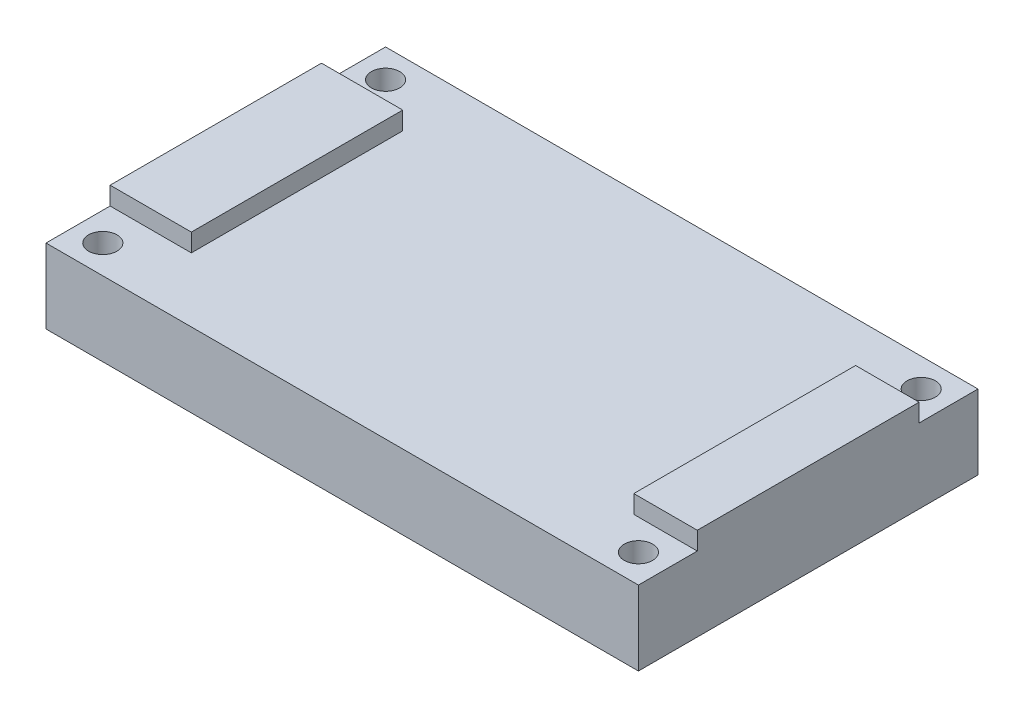
ISO-10303-21;
HEADER;
FILE_DESCRIPTION(('STEP AP214'),'2;1');
FILE_NAME('part.step','',(''),(''),'','','');
FILE_SCHEMA(('AUTOMOTIVE_DESIGN { 1 0 10303 214 1 1 1 1 }'));
ENDSEC;
DATA;
#1=APPLICATION_CONTEXT('core data for automotive mechanical design processes');
#2=APPLICATION_PROTOCOL_DEFINITION('international standard','automotive_design',2000,#1);
#3=PRODUCT_CONTEXT('',#1,'mechanical');
#4=PRODUCT('Part','Part','',(#3));
#5=PRODUCT_RELATED_PRODUCT_CATEGORY('part','',(#4));
#6=PRODUCT_DEFINITION_FORMATION('','',#4);
#7=PRODUCT_DEFINITION_CONTEXT('part definition',#1,'design');
#8=PRODUCT_DEFINITION('design','',#6,#7);
#9=PRODUCT_DEFINITION_SHAPE('','',#8);
#10=(LENGTH_UNIT() NAMED_UNIT(*) SI_UNIT(.MILLI.,.METRE.));
#11=(NAMED_UNIT(*) PLANE_ANGLE_UNIT() SI_UNIT($,.RADIAN.));
#12=(NAMED_UNIT(*) SI_UNIT($,.STERADIAN.) SOLID_ANGLE_UNIT());
#13=UNCERTAINTY_MEASURE_WITH_UNIT(LENGTH_MEASURE(1.E-05),#10,'distance_accuracy_value','');
#14=(GEOMETRIC_REPRESENTATION_CONTEXT(3) GLOBAL_UNCERTAINTY_ASSIGNED_CONTEXT((#13)) GLOBAL_UNIT_ASSIGNED_CONTEXT((#10,
#11,#12)) REPRESENTATION_CONTEXT('',''));
#15=CARTESIAN_POINT('',(0.,0.,0.));
#16=DIRECTION('',(0.,0.,1.));
#17=DIRECTION('',(1.,0.,0.));
#18=AXIS2_PLACEMENT_3D('',#15,#16,#17);
#19=CARTESIAN_POINT('',(0.,5.2451,0.));
#20=DIRECTION('',(0.,1.,0.));
#21=DIRECTION('',(0.,0.,1.));
#22=AXIS2_PLACEMENT_3D('',#19,#20,#21);
#23=PLANE('',#22);
#24=CARTESIAN_POINT('',(-18.85975,5.2451,9.95705));
#25=DIRECTION('',(0.,1.,0.));
#26=DIRECTION('',(0.,0.,1.));
#27=AXIS2_PLACEMENT_3D('',#24,#25,#26);
#28=CIRCLE('',#27,1.);
#29=CARTESIAN_POINT('',(-18.85975,5.2451,10.95705));
#30=VERTEX_POINT('',#29);
#31=EDGE_CURVE('E199',#30,#30,#28,.T.);
#32=ORIENTED_EDGE('',*,*,#31,.F.);
#33=EDGE_LOOP('',(#32));
#34=FACE_BOUND('',#33,.T.);
#35=CARTESIAN_POINT('',(18.85975,5.2451,9.95705));
#36=DIRECTION('',(0.,1.,0.));
#37=DIRECTION('',(0.,0.,1.));
#38=AXIS2_PLACEMENT_3D('',#35,#36,#37);
#39=CIRCLE('',#38,1.);
#40=CARTESIAN_POINT('',(18.85975,5.2451,10.95705));
#41=VERTEX_POINT('',#40);
#42=EDGE_CURVE('E196',#41,#41,#39,.T.);
#43=ORIENTED_EDGE('',*,*,#42,.F.);
#44=EDGE_LOOP('',(#43));
#45=FACE_BOUND('',#44,.T.);
#46=CARTESIAN_POINT('',(18.85975,5.2451,-9.95705));
#47=DIRECTION('',(0.,1.,0.));
#48=DIRECTION('',(0.,0.,1.));
#49=AXIS2_PLACEMENT_3D('',#46,#47,#48);
#50=CIRCLE('',#49,1.);
#51=CARTESIAN_POINT('',(18.85975,5.2451,-8.95705));
#52=VERTEX_POINT('',#51);
#53=EDGE_CURVE('E193',#52,#52,#50,.T.);
#54=ORIENTED_EDGE('',*,*,#53,.F.);
#55=EDGE_LOOP('',(#54));
#56=FACE_BOUND('',#55,.T.);
#57=CARTESIAN_POINT('',(-18.85975,5.2451,-9.95705));
#58=DIRECTION('',(0.,1.,0.));
#59=DIRECTION('',(0.,0.,1.));
#60=AXIS2_PLACEMENT_3D('',#57,#58,#59);
#61=CIRCLE('',#60,1.);
#62=CARTESIAN_POINT('',(-18.85975,5.2451,-8.95705));
#63=VERTEX_POINT('',#62);
#64=EDGE_CURVE('E190',#63,#63,#61,.T.);
#65=ORIENTED_EDGE('',*,*,#64,.F.);
#66=EDGE_LOOP('',(#65));
#67=FACE_BOUND('',#66,.T.);
#68=DIRECTION('',(0.,0.,-1.));
#69=VECTOR('',#68,1.);
#70=CARTESIAN_POINT('',(-15.1390278048941,5.2451,-7.4422));
#71=LINE('',#70,#69);
#72=CARTESIAN_POINT('',(-15.1390278048941,5.2451,7.4422));
#73=VERTEX_POINT('',#72);
#74=CARTESIAN_POINT('',(-15.1390278048941,5.2451,-7.4422));
#75=VERTEX_POINT('',#74);
#76=EDGE_CURVE('E294',#73,#75,#71,.T.);
#77=ORIENTED_EDGE('',*,*,#76,.F.);
#78=DIRECTION('',(1.,0.,0.));
#79=VECTOR('',#78,1.);
#80=CARTESIAN_POINT('',(-20.85975,5.2451,7.4422));
#81=LINE('',#80,#79);
#82=CARTESIAN_POINT('',(-20.85975,5.2451,7.4422));
#83=VERTEX_POINT('',#82);
#84=EDGE_CURVE('E293',#83,#73,#81,.T.);
#85=ORIENTED_EDGE('',*,*,#84,.F.);
#86=DIRECTION('',(0.,0.,1.));
#87=VECTOR('',#86,1.);
#88=CARTESIAN_POINT('',(-20.85975,5.2451,11.95705));
#89=LINE('',#88,#87);
#90=CARTESIAN_POINT('',(-20.85975,5.2451,11.95705));
#91=VERTEX_POINT('',#90);
#92=EDGE_CURVE('E146',#83,#91,#89,.T.);
#93=ORIENTED_EDGE('',*,*,#92,.T.);
#94=DIRECTION('',(1.,0.,0.));
#95=VECTOR('',#94,1.);
#96=CARTESIAN_POINT('',(20.85975,5.2451,11.95705));
#97=LINE('',#96,#95);
#98=CARTESIAN_POINT('',(20.85975,5.2451,11.95705));
#99=VERTEX_POINT('',#98);
#100=EDGE_CURVE('E206',#91,#99,#97,.T.);
#101=ORIENTED_EDGE('',*,*,#100,.T.);
#102=DIRECTION('',(0.,0.,-1.));
#103=VECTOR('',#102,1.);
#104=CARTESIAN_POINT('',(20.85975,5.2451,11.95705));
#105=LINE('',#104,#103);
#106=CARTESIAN_POINT('',(20.85975,5.2451,7.8105));
#107=VERTEX_POINT('',#106);
#108=EDGE_CURVE('E209',#99,#107,#105,.T.);
#109=ORIENTED_EDGE('',*,*,#108,.T.);
#110=DIRECTION('',(1.,0.,0.));
#111=VECTOR('',#110,1.);
#112=CARTESIAN_POINT('',(20.85975,5.2451,7.8105));
#113=LINE('',#112,#111);
#114=CARTESIAN_POINT('',(16.3871308605648,5.2451,7.8105));
#115=VERTEX_POINT('',#114);
#116=EDGE_CURVE('E56',#115,#107,#113,.T.);
#117=ORIENTED_EDGE('',*,*,#116,.F.);
#118=DIRECTION('',(0.,0.,1.));
#119=VECTOR('',#118,1.);
#120=CARTESIAN_POINT('',(16.3871308605648,5.2451,-7.8105));
#121=LINE('',#120,#119);
#122=CARTESIAN_POINT('',(16.3871308605648,5.2451,-7.8105));
#123=VERTEX_POINT('',#122);
#124=EDGE_CURVE('E150',#123,#115,#121,.T.);
#125=ORIENTED_EDGE('',*,*,#124,.F.);
#126=DIRECTION('',(-1.,0.,0.));
#127=VECTOR('',#126,1.);
#128=CARTESIAN_POINT('',(20.85975,5.2451,-7.8105));
#129=LINE('',#128,#127);
#130=CARTESIAN_POINT('',(20.85975,5.2451,-7.81049999999999));
#131=VERTEX_POINT('',#130);
#132=EDGE_CURVE('E147',#131,#123,#129,.T.);
#133=ORIENTED_EDGE('',*,*,#132,.F.);
#134=CARTESIAN_POINT('',(20.85975,5.2451,-11.95705));
#135=VERTEX_POINT('',#134);
#136=EDGE_CURVE('E208',#131,#135,#105,.T.);
#137=ORIENTED_EDGE('',*,*,#136,.T.);
#138=DIRECTION('',(-1.,0.,0.));
#139=VECTOR('',#138,1.);
#140=CARTESIAN_POINT('',(20.85975,5.2451,-11.95705));
#141=LINE('',#140,#139);
#142=CARTESIAN_POINT('',(-20.85975,5.2451,-11.95705));
#143=VERTEX_POINT('',#142);
#144=EDGE_CURVE('E211',#135,#143,#141,.T.);
#145=ORIENTED_EDGE('',*,*,#144,.T.);
#146=CARTESIAN_POINT('',(-20.85975,5.2451,-7.4422));
#147=VERTEX_POINT('',#146);
#148=EDGE_CURVE('E203',#143,#147,#89,.T.);
#149=ORIENTED_EDGE('',*,*,#148,.T.);
#150=DIRECTION('',(-1.,0.,0.));
#151=VECTOR('',#150,1.);
#152=CARTESIAN_POINT('',(-20.85975,5.2451,-7.4422));
#153=LINE('',#152,#151);
#154=EDGE_CURVE('E141',#75,#147,#153,.T.);
#155=ORIENTED_EDGE('',*,*,#154,.F.);
#156=EDGE_LOOP('',(#77,#85,#93,#101,#109,#117,#125,#133,#137,#145,#149,#155));
#157=FACE_BOUND('',#156,.T.);
#158=ADVANCED_FACE('F33',(#34,#45,#56,#67,#157),#23,.T.);
#159=CARTESIAN_POINT('',(-20.85975,5.2451,11.95705));
#160=DIRECTION('',(1.,0.,0.));
#161=DIRECTION('',(0.,0.,-1.));
#162=AXIS2_PLACEMENT_3D('',#159,#160,#161);
#163=PLANE('',#162);
#164=DIRECTION('',(0.,0.,1.));
#165=VECTOR('',#164,1.);
#166=CARTESIAN_POINT('',(-20.85975,0.,11.95705));
#167=LINE('',#166,#165);
#168=CARTESIAN_POINT('',(-20.85975,0.,-11.95705));
#169=VERTEX_POINT('',#168);
#170=CARTESIAN_POINT('',(-20.85975,0.,11.95705));
#171=VERTEX_POINT('',#170);
#172=EDGE_CURVE('E202',#169,#171,#167,.T.);
#173=ORIENTED_EDGE('',*,*,#172,.T.);
#174=DIRECTION('',(0.,-1.,0.));
#175=VECTOR('',#174,1.);
#176=CARTESIAN_POINT('',(-20.85975,5.2451,11.95705));
#177=LINE('',#176,#175);
#178=EDGE_CURVE('E11',#91,#171,#177,.T.);
#179=ORIENTED_EDGE('',*,*,#178,.F.);
#180=ORIENTED_EDGE('',*,*,#92,.F.);
#181=DIRECTION('',(0.,-1.,0.));
#182=VECTOR('',#181,1.);
#183=CARTESIAN_POINT('',(-20.85975,6.5151,7.4422));
#184=LINE('',#183,#182);
#185=CARTESIAN_POINT('',(-20.85975,6.5151,7.4422));
#186=VERTEX_POINT('',#185);
#187=EDGE_CURVE('E126',#186,#83,#184,.T.);
#188=ORIENTED_EDGE('',*,*,#187,.F.);
#189=DIRECTION('',(0.,0.,1.));
#190=VECTOR('',#189,1.);
#191=CARTESIAN_POINT('',(-20.85975,6.5151,-7.4422));
#192=LINE('',#191,#190);
#193=CARTESIAN_POINT('',(-20.85975,6.5151,-7.4422));
#194=VERTEX_POINT('',#193);
#195=EDGE_CURVE('E133',#194,#186,#192,.T.);
#196=ORIENTED_EDGE('',*,*,#195,.F.);
#197=DIRECTION('',(0.,-1.,0.));
#198=VECTOR('',#197,1.);
#199=CARTESIAN_POINT('',(-20.85975,6.5151,-7.4422));
#200=LINE('',#199,#198);
#201=EDGE_CURVE('E243',#194,#147,#200,.T.);
#202=ORIENTED_EDGE('',*,*,#201,.T.);
#203=ORIENTED_EDGE('',*,*,#148,.F.);
#204=DIRECTION('',(0.,-1.,0.));
#205=VECTOR('',#204,1.);
#206=CARTESIAN_POINT('',(-20.85975,5.2451,-11.95705));
#207=LINE('',#206,#205);
#208=EDGE_CURVE('E213',#143,#169,#207,.T.);
#209=ORIENTED_EDGE('',*,*,#208,.T.);
#210=EDGE_LOOP('',(#173,#179,#180,#188,#196,#202,#203,#209));
#211=FACE_BOUND('',#210,.T.);
#212=ADVANCED_FACE('F35',(#211),#163,.F.);
#213=CARTESIAN_POINT('',(20.85975,5.2451,11.95705));
#214=DIRECTION('',(0.,0.,-1.));
#215=DIRECTION('',(-1.,0.,0.));
#216=AXIS2_PLACEMENT_3D('',#213,#214,#215);
#217=PLANE('',#216);
#218=DIRECTION('',(1.,0.,0.));
#219=VECTOR('',#218,1.);
#220=CARTESIAN_POINT('',(20.85975,0.,11.95705));
#221=LINE('',#220,#219);
#222=CARTESIAN_POINT('',(20.85975,0.,11.95705));
#223=VERTEX_POINT('',#222);
#224=EDGE_CURVE('E215',#171,#223,#221,.T.);
#225=ORIENTED_EDGE('',*,*,#224,.T.);
#226=DIRECTION('',(0.,-1.,0.));
#227=VECTOR('',#226,1.);
#228=CARTESIAN_POINT('',(20.85975,5.2451,11.95705));
#229=LINE('',#228,#227);
#230=EDGE_CURVE('E41',#99,#223,#229,.T.);
#231=ORIENTED_EDGE('',*,*,#230,.F.);
#232=ORIENTED_EDGE('',*,*,#100,.F.);
#233=ORIENTED_EDGE('',*,*,#178,.T.);
#234=EDGE_LOOP('',(#225,#231,#232,#233));
#235=FACE_BOUND('',#234,.T.);
#236=ADVANCED_FACE('F277',(#235),#217,.F.);
#237=CARTESIAN_POINT('',(20.85975,5.2451,11.95705));
#238=DIRECTION('',(-1.,0.,0.));
#239=DIRECTION('',(0.,0.,1.));
#240=AXIS2_PLACEMENT_3D('',#237,#238,#239);
#241=PLANE('',#240);
#242=DIRECTION('',(0.,0.,-1.));
#243=VECTOR('',#242,1.);
#244=CARTESIAN_POINT('',(20.85975,0.,11.95705));
#245=LINE('',#244,#243);
#246=CARTESIAN_POINT('',(20.85975,0.,-11.95705));
#247=VERTEX_POINT('',#246);
#248=EDGE_CURVE('E217',#223,#247,#245,.T.);
#249=ORIENTED_EDGE('',*,*,#248,.T.);
#250=DIRECTION('',(0.,-1.,0.));
#251=VECTOR('',#250,1.);
#252=CARTESIAN_POINT('',(20.85975,5.2451,-11.95705));
#253=LINE('',#252,#251);
#254=EDGE_CURVE('E223',#135,#247,#253,.T.);
#255=ORIENTED_EDGE('',*,*,#254,.F.);
#256=ORIENTED_EDGE('',*,*,#136,.F.);
#257=DIRECTION('',(0.,-1.,0.));
#258=VECTOR('',#257,1.);
#259=CARTESIAN_POINT('',(20.85975,6.5151,-7.8105));
#260=LINE('',#259,#258);
#261=CARTESIAN_POINT('',(20.85975,6.5151,-7.8105));
#262=VERTEX_POINT('',#261);
#263=EDGE_CURVE('E175',#262,#131,#260,.T.);
#264=ORIENTED_EDGE('',*,*,#263,.F.);
#265=DIRECTION('',(0.,0.,-1.));
#266=VECTOR('',#265,1.);
#267=CARTESIAN_POINT('',(20.85975,6.5151,-7.8105));
#268=LINE('',#267,#266);
#269=CARTESIAN_POINT('',(20.85975,6.5151,7.8105));
#270=VERTEX_POINT('',#269);
#271=EDGE_CURVE('E155',#270,#262,#268,.T.);
#272=ORIENTED_EDGE('',*,*,#271,.F.);
#273=DIRECTION('',(0.,-1.,0.));
#274=VECTOR('',#273,1.);
#275=CARTESIAN_POINT('',(20.85975,6.5151,7.8105));
#276=LINE('',#275,#274);
#277=EDGE_CURVE('E163',#270,#107,#276,.T.);
#278=ORIENTED_EDGE('',*,*,#277,.T.);
#279=ORIENTED_EDGE('',*,*,#108,.F.);
#280=ORIENTED_EDGE('',*,*,#230,.T.);
#281=EDGE_LOOP('',(#249,#255,#256,#264,#272,#278,#279,#280));
#282=FACE_BOUND('',#281,.T.);
#283=ADVANCED_FACE('F230',(#282),#241,.F.);
#284=CARTESIAN_POINT('',(20.85975,5.2451,-11.95705));
#285=DIRECTION('',(0.,0.,1.));
#286=DIRECTION('',(1.,0.,0.));
#287=AXIS2_PLACEMENT_3D('',#284,#285,#286);
#288=PLANE('',#287);
#289=DIRECTION('',(-1.,0.,0.));
#290=VECTOR('',#289,1.);
#291=CARTESIAN_POINT('',(20.85975,0.,-11.95705));
#292=LINE('',#291,#290);
#293=EDGE_CURVE('E219',#247,#169,#292,.T.);
#294=ORIENTED_EDGE('',*,*,#293,.T.);
#295=ORIENTED_EDGE('',*,*,#208,.F.);
#296=ORIENTED_EDGE('',*,*,#144,.F.);
#297=ORIENTED_EDGE('',*,*,#254,.T.);
#298=EDGE_LOOP('',(#294,#295,#296,#297));
#299=FACE_BOUND('',#298,.T.);
#300=ADVANCED_FACE('F240',(#299),#288,.F.);
#301=CARTESIAN_POINT('',(0.,0.,0.));
#302=DIRECTION('',(0.,1.,0.));
#303=DIRECTION('',(0.,0.,1.));
#304=AXIS2_PLACEMENT_3D('',#301,#302,#303);
#305=PLANE('',#304);
#306=CARTESIAN_POINT('',(-18.85975,0.,9.95705));
#307=DIRECTION('',(0.,1.,0.));
#308=DIRECTION('',(0.,0.,-1.));
#309=AXIS2_PLACEMENT_3D('',#306,#307,#308);
#310=CIRCLE('',#309,1.);
#311=CARTESIAN_POINT('',(-18.85975,0.,8.95705));
#312=VERTEX_POINT('',#311);
#313=EDGE_CURVE('E178',#312,#312,#310,.T.);
#314=ORIENTED_EDGE('',*,*,#313,.T.);
#315=EDGE_LOOP('',(#314));
#316=FACE_BOUND('',#315,.T.);
#317=CARTESIAN_POINT('',(18.85975,0.,9.95705));
#318=DIRECTION('',(0.,1.,0.));
#319=DIRECTION('',(0.,0.,1.));
#320=AXIS2_PLACEMENT_3D('',#317,#318,#319);
#321=CIRCLE('',#320,1.);
#322=CARTESIAN_POINT('',(18.85975,0.,10.95705));
#323=VERTEX_POINT('',#322);
#324=EDGE_CURVE('E183',#323,#323,#321,.T.);
#325=ORIENTED_EDGE('',*,*,#324,.T.);
#326=EDGE_LOOP('',(#325));
#327=FACE_BOUND('',#326,.T.);
#328=CARTESIAN_POINT('',(18.85975,0.,-9.95705));
#329=DIRECTION('',(0.,1.,0.));
#330=DIRECTION('',(0.,0.,-1.));
#331=AXIS2_PLACEMENT_3D('',#328,#329,#330);
#332=CIRCLE('',#331,1.);
#333=CARTESIAN_POINT('',(18.85975,0.,-10.95705));
#334=VERTEX_POINT('',#333);
#335=EDGE_CURVE('E179',#334,#334,#332,.T.);
#336=ORIENTED_EDGE('',*,*,#335,.T.);
#337=EDGE_LOOP('',(#336));
#338=FACE_BOUND('',#337,.T.);
#339=CARTESIAN_POINT('',(-18.85975,0.,-9.95705));
#340=DIRECTION('',(0.,1.,0.));
#341=DIRECTION('',(0.,0.,1.));
#342=AXIS2_PLACEMENT_3D('',#339,#340,#341);
#343=CIRCLE('',#342,1.);
#344=CARTESIAN_POINT('',(-18.85975,0.,-8.95705));
#345=VERTEX_POINT('',#344);
#346=EDGE_CURVE('E182',#345,#345,#343,.T.);
#347=ORIENTED_EDGE('',*,*,#346,.T.);
#348=EDGE_LOOP('',(#347));
#349=FACE_BOUND('',#348,.T.);
#350=ORIENTED_EDGE('',*,*,#172,.F.);
#351=ORIENTED_EDGE('',*,*,#293,.F.);
#352=ORIENTED_EDGE('',*,*,#248,.F.);
#353=ORIENTED_EDGE('',*,*,#224,.F.);
#354=EDGE_LOOP('',(#350,#351,#352,#353));
#355=FACE_BOUND('',#354,.T.);
#356=ADVANCED_FACE('F237',(#316,#327,#338,#349,#355),#305,.F.);
#357=CARTESIAN_POINT('',(-18.85975,0.,-9.95705));
#358=DIRECTION('',(0.,1.,0.));
#359=DIRECTION('',(0.,0.,1.));
#360=AXIS2_PLACEMENT_3D('',#357,#358,#359);
#361=CYLINDRICAL_SURFACE('',#360,1.);
#362=ORIENTED_EDGE('',*,*,#64,.T.);
#363=EDGE_LOOP('',(#362));
#364=FACE_BOUND('',#363,.T.);
#365=ORIENTED_EDGE('',*,*,#346,.F.);
#366=EDGE_LOOP('',(#365));
#367=FACE_BOUND('',#366,.T.);
#368=ADVANCED_FACE('F282',(#364,#367),#361,.F.);
#369=CARTESIAN_POINT('',(18.85975,0.,-9.95705));
#370=DIRECTION('',(0.,1.,0.));
#371=DIRECTION('',(0.,0.,1.));
#372=AXIS2_PLACEMENT_3D('',#369,#370,#371);
#373=CYLINDRICAL_SURFACE('',#372,1.);
#374=ORIENTED_EDGE('',*,*,#53,.T.);
#375=EDGE_LOOP('',(#374));
#376=FACE_BOUND('',#375,.T.);
#377=ORIENTED_EDGE('',*,*,#335,.F.);
#378=EDGE_LOOP('',(#377));
#379=FACE_BOUND('',#378,.T.);
#380=ADVANCED_FACE('F395',(#376,#379),#373,.F.);
#381=CARTESIAN_POINT('',(18.85975,0.,9.95705));
#382=DIRECTION('',(0.,1.,0.));
#383=DIRECTION('',(0.,0.,1.));
#384=AXIS2_PLACEMENT_3D('',#381,#382,#383);
#385=CYLINDRICAL_SURFACE('',#384,1.);
#386=ORIENTED_EDGE('',*,*,#42,.T.);
#387=EDGE_LOOP('',(#386));
#388=FACE_BOUND('',#387,.T.);
#389=ORIENTED_EDGE('',*,*,#324,.F.);
#390=EDGE_LOOP('',(#389));
#391=FACE_BOUND('',#390,.T.);
#392=ADVANCED_FACE('F387',(#388,#391),#385,.F.);
#393=CARTESIAN_POINT('',(-18.85975,0.,9.95705));
#394=DIRECTION('',(0.,1.,0.));
#395=DIRECTION('',(0.,0.,1.));
#396=AXIS2_PLACEMENT_3D('',#393,#394,#395);
#397=CYLINDRICAL_SURFACE('',#396,1.);
#398=ORIENTED_EDGE('',*,*,#31,.T.);
#399=EDGE_LOOP('',(#398));
#400=FACE_BOUND('',#399,.T.);
#401=ORIENTED_EDGE('',*,*,#313,.F.);
#402=EDGE_LOOP('',(#401));
#403=FACE_BOUND('',#402,.T.);
#404=ADVANCED_FACE('F269',(#400,#403),#397,.F.);
#405=CARTESIAN_POINT('',(20.85975,6.5151,-7.8105));
#406=DIRECTION('',(0.,0.,1.));
#407=DIRECTION('',(1.,0.,0.));
#408=AXIS2_PLACEMENT_3D('',#405,#406,#407);
#409=PLANE('',#408);
#410=ORIENTED_EDGE('',*,*,#132,.T.);
#411=DIRECTION('',(0.,-1.,0.));
#412=VECTOR('',#411,1.);
#413=CARTESIAN_POINT('',(16.3871308605648,6.5151,-7.8105));
#414=LINE('',#413,#412);
#415=CARTESIAN_POINT('',(16.3871308605648,6.5151,-7.8105));
#416=VERTEX_POINT('',#415);
#417=EDGE_CURVE('E172',#416,#123,#414,.T.);
#418=ORIENTED_EDGE('',*,*,#417,.F.);
#419=DIRECTION('',(-1.,0.,0.));
#420=VECTOR('',#419,1.);
#421=CARTESIAN_POINT('',(20.85975,6.5151,-7.8105));
#422=LINE('',#421,#420);
#423=EDGE_CURVE('E158',#262,#416,#422,.T.);
#424=ORIENTED_EDGE('',*,*,#423,.F.);
#425=ORIENTED_EDGE('',*,*,#263,.T.);
#426=EDGE_LOOP('',(#410,#418,#424,#425));
#427=FACE_BOUND('',#426,.T.);
#428=ADVANCED_FACE('F250',(#427),#409,.F.);
#429=CARTESIAN_POINT('',(16.3871308605648,6.5151,-7.8105));
#430=DIRECTION('',(1.,0.,0.));
#431=DIRECTION('',(0.,0.,-1.));
#432=AXIS2_PLACEMENT_3D('',#429,#430,#431);
#433=PLANE('',#432);
#434=ORIENTED_EDGE('',*,*,#124,.T.);
#435=DIRECTION('',(0.,-1.,0.));
#436=VECTOR('',#435,1.);
#437=CARTESIAN_POINT('',(16.3871308605648,6.5151,7.8105));
#438=LINE('',#437,#436);
#439=CARTESIAN_POINT('',(16.3871308605648,6.5151,7.8105));
#440=VERTEX_POINT('',#439);
#441=EDGE_CURVE('E169',#440,#115,#438,.T.);
#442=ORIENTED_EDGE('',*,*,#441,.F.);
#443=DIRECTION('',(0.,0.,1.));
#444=VECTOR('',#443,1.);
#445=CARTESIAN_POINT('',(16.3871308605648,6.5151,-7.8105));
#446=LINE('',#445,#444);
#447=EDGE_CURVE('E160',#416,#440,#446,.T.);
#448=ORIENTED_EDGE('',*,*,#447,.F.);
#449=ORIENTED_EDGE('',*,*,#417,.T.);
#450=EDGE_LOOP('',(#434,#442,#448,#449));
#451=FACE_BOUND('',#450,.T.);
#452=ADVANCED_FACE('F261',(#451),#433,.F.);
#453=CARTESIAN_POINT('',(20.85975,6.5151,7.8105));
#454=DIRECTION('',(0.,0.,-1.));
#455=DIRECTION('',(-1.,0.,0.));
#456=AXIS2_PLACEMENT_3D('',#453,#454,#455);
#457=PLANE('',#456);
#458=ORIENTED_EDGE('',*,*,#116,.T.);
#459=ORIENTED_EDGE('',*,*,#277,.F.);
#460=DIRECTION('',(1.,0.,0.));
#461=VECTOR('',#460,1.);
#462=CARTESIAN_POINT('',(20.85975,6.5151,7.8105));
#463=LINE('',#462,#461);
#464=EDGE_CURVE('E162',#440,#270,#463,.T.);
#465=ORIENTED_EDGE('',*,*,#464,.F.);
#466=ORIENTED_EDGE('',*,*,#441,.T.);
#467=EDGE_LOOP('',(#458,#459,#465,#466));
#468=FACE_BOUND('',#467,.T.);
#469=ADVANCED_FACE('F258',(#468),#457,.F.);
#470=CARTESIAN_POINT('',(0.,6.5151,0.));
#471=DIRECTION('',(0.,-1.,0.));
#472=DIRECTION('',(0.,0.,-1.));
#473=AXIS2_PLACEMENT_3D('',#470,#471,#472);
#474=PLANE('',#473);
#475=ORIENTED_EDGE('',*,*,#271,.T.);
#476=ORIENTED_EDGE('',*,*,#423,.T.);
#477=ORIENTED_EDGE('',*,*,#447,.T.);
#478=ORIENTED_EDGE('',*,*,#464,.T.);
#479=EDGE_LOOP('',(#475,#476,#477,#478));
#480=FACE_BOUND('',#479,.T.);
#481=ADVANCED_FACE('F254',(#480),#474,.F.);
#482=CARTESIAN_POINT('',(-20.85975,6.5151,7.4422));
#483=DIRECTION('',(0.,0.,-1.));
#484=DIRECTION('',(-1.,0.,0.));
#485=AXIS2_PLACEMENT_3D('',#482,#483,#484);
#486=PLANE('',#485);
#487=ORIENTED_EDGE('',*,*,#84,.T.);
#488=DIRECTION('',(0.,-1.,0.));
#489=VECTOR('',#488,1.);
#490=CARTESIAN_POINT('',(-15.1390278048941,6.5151,7.4422));
#491=LINE('',#490,#489);
#492=CARTESIAN_POINT('',(-15.1390278048941,6.5151,7.4422));
#493=VERTEX_POINT('',#492);
#494=EDGE_CURVE('E129',#493,#73,#491,.T.);
#495=ORIENTED_EDGE('',*,*,#494,.F.);
#496=DIRECTION('',(1.,0.,0.));
#497=VECTOR('',#496,1.);
#498=CARTESIAN_POINT('',(-20.85975,6.5151,7.4422));
#499=LINE('',#498,#497);
#500=EDGE_CURVE('E122',#186,#493,#499,.T.);
#501=ORIENTED_EDGE('',*,*,#500,.F.);
#502=ORIENTED_EDGE('',*,*,#187,.T.);
#503=EDGE_LOOP('',(#487,#495,#501,#502));
#504=FACE_BOUND('',#503,.T.);
#505=ADVANCED_FACE('F124',(#504),#486,.F.);
#506=CARTESIAN_POINT('',(-15.1390278048941,6.5151,-7.4422));
#507=DIRECTION('',(-1.,0.,0.));
#508=DIRECTION('',(0.,0.,1.));
#509=AXIS2_PLACEMENT_3D('',#506,#507,#508);
#510=PLANE('',#509);
#511=ORIENTED_EDGE('',*,*,#76,.T.);
#512=DIRECTION('',(0.,-1.,0.));
#513=VECTOR('',#512,1.);
#514=CARTESIAN_POINT('',(-15.1390278048941,6.5151,-7.4422));
#515=LINE('',#514,#513);
#516=CARTESIAN_POINT('',(-15.1390278048941,6.5151,-7.4422));
#517=VERTEX_POINT('',#516);
#518=EDGE_CURVE('E48',#517,#75,#515,.T.);
#519=ORIENTED_EDGE('',*,*,#518,.F.);
#520=DIRECTION('',(0.,0.,-1.));
#521=VECTOR('',#520,1.);
#522=CARTESIAN_POINT('',(-15.1390278048941,6.5151,-7.4422));
#523=LINE('',#522,#521);
#524=EDGE_CURVE('E132',#493,#517,#523,.T.);
#525=ORIENTED_EDGE('',*,*,#524,.F.);
#526=ORIENTED_EDGE('',*,*,#494,.T.);
#527=EDGE_LOOP('',(#511,#519,#525,#526));
#528=FACE_BOUND('',#527,.T.);
#529=ADVANCED_FACE('F302',(#528),#510,.F.);
#530=CARTESIAN_POINT('',(-20.85975,6.5151,-7.4422));
#531=DIRECTION('',(0.,0.,1.));
#532=DIRECTION('',(1.,0.,0.));
#533=AXIS2_PLACEMENT_3D('',#530,#531,#532);
#534=PLANE('',#533);
#535=ORIENTED_EDGE('',*,*,#154,.T.);
#536=ORIENTED_EDGE('',*,*,#201,.F.);
#537=DIRECTION('',(-1.,0.,0.));
#538=VECTOR('',#537,1.);
#539=CARTESIAN_POINT('',(-20.85975,6.5151,-7.4422));
#540=LINE('',#539,#538);
#541=EDGE_CURVE('E137',#517,#194,#540,.T.);
#542=ORIENTED_EDGE('',*,*,#541,.F.);
#543=ORIENTED_EDGE('',*,*,#518,.T.);
#544=EDGE_LOOP('',(#535,#536,#542,#543));
#545=FACE_BOUND('',#544,.T.);
#546=ADVANCED_FACE('F303',(#545),#534,.F.);
#547=CARTESIAN_POINT('',(0.,6.5151,0.));
#548=DIRECTION('',(0.,1.,0.));
#549=DIRECTION('',(0.,0.,1.));
#550=AXIS2_PLACEMENT_3D('',#547,#548,#549);
#551=PLANE('',#550);
#552=ORIENTED_EDGE('',*,*,#195,.T.);
#553=ORIENTED_EDGE('',*,*,#500,.T.);
#554=ORIENTED_EDGE('',*,*,#524,.T.);
#555=ORIENTED_EDGE('',*,*,#541,.T.);
#556=EDGE_LOOP('',(#552,#553,#554,#555));
#557=FACE_BOUND('',#556,.T.);
#558=ADVANCED_FACE('F136',(#557),#551,.T.);
#559=CLOSED_SHELL('',(#158,#212,#236,#283,#300,#356,#368,#380,#392,#404,#428,#452,#469,#481,
#505,#529,#546,#558));
#560=MANIFOLD_SOLID_BREP('B2',#559);
#561=ADVANCED_BREP_SHAPE_REPRESENTATION('',(#18,#560),#14);
#562=SHAPE_DEFINITION_REPRESENTATION(#9,#561);
ENDSEC;
END-ISO-10303-21;
